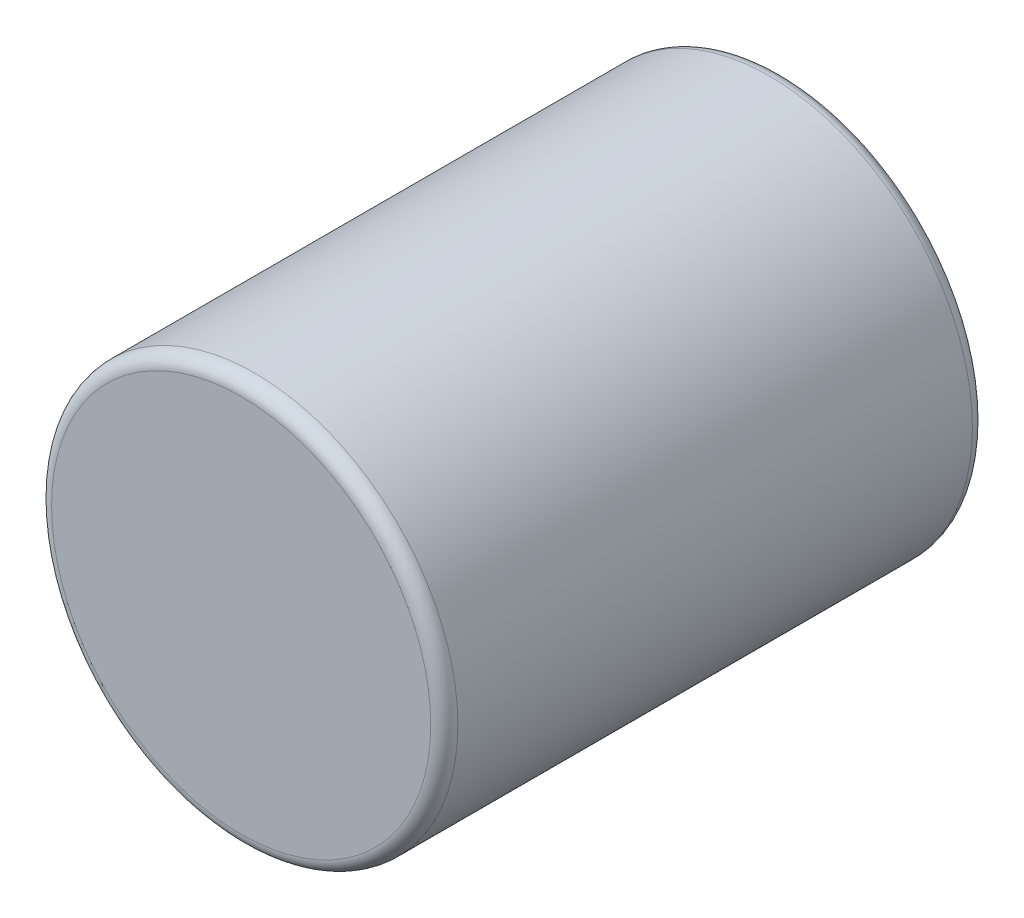
ISO-10303-21;
HEADER;
FILE_DESCRIPTION(('STEP AP214'),'2;1');
FILE_NAME('part.step','',(''),(''),'','','');
FILE_SCHEMA(('AUTOMOTIVE_DESIGN { 1 0 10303 214 1 1 1 1 }'));
ENDSEC;
DATA;
#1=APPLICATION_CONTEXT('core data for automotive mechanical design processes');
#2=APPLICATION_PROTOCOL_DEFINITION('international standard','automotive_design',2000,#1);
#3=PRODUCT_CONTEXT('',#1,'mechanical');
#4=PRODUCT('Part','Part','',(#3));
#5=PRODUCT_RELATED_PRODUCT_CATEGORY('part','',(#4));
#6=PRODUCT_DEFINITION_FORMATION('','',#4);
#7=PRODUCT_DEFINITION_CONTEXT('part definition',#1,'design');
#8=PRODUCT_DEFINITION('design','',#6,#7);
#9=PRODUCT_DEFINITION_SHAPE('','',#8);
#10=(LENGTH_UNIT() NAMED_UNIT(*) SI_UNIT(.MILLI.,.METRE.));
#11=(NAMED_UNIT(*) PLANE_ANGLE_UNIT() SI_UNIT($,.RADIAN.));
#12=(NAMED_UNIT(*) SI_UNIT($,.STERADIAN.) SOLID_ANGLE_UNIT());
#13=UNCERTAINTY_MEASURE_WITH_UNIT(LENGTH_MEASURE(1.E-05),#10,'distance_accuracy_value','');
#14=(GEOMETRIC_REPRESENTATION_CONTEXT(3) GLOBAL_UNCERTAINTY_ASSIGNED_CONTEXT((#13)) GLOBAL_UNIT_ASSIGNED_CONTEXT((#10,
#11,#12)) REPRESENTATION_CONTEXT('',''));
#15=CARTESIAN_POINT('',(0.,0.,0.));
#16=DIRECTION('',(0.,0.,1.));
#17=DIRECTION('',(1.,0.,0.));
#18=AXIS2_PLACEMENT_3D('',#15,#16,#17);
#19=CARTESIAN_POINT('',(0.,0.,4.));
#20=DIRECTION('',(0.,0.,-1.));
#21=DIRECTION('',(-1.,0.,0.));
#22=AXIS2_PLACEMENT_3D('',#19,#20,#21);
#23=CYLINDRICAL_SURFACE('',#22,1.5);
#24=CARTESIAN_POINT('',(0.,0.,3.9));
#25=DIRECTION('',(0.,0.,1.));
#26=DIRECTION('',(1.,0.,0.));
#27=AXIS2_PLACEMENT_3D('',#24,#25,#26);
#28=CIRCLE('',#27,1.5);
#29=CARTESIAN_POINT('',(1.5,0.,3.9));
#30=VERTEX_POINT('',#29);
#31=EDGE_CURVE('E45',#30,#30,#28,.F.);
#32=ORIENTED_EDGE('',*,*,#31,.T.);
#33=EDGE_LOOP('',(#32));
#34=FACE_BOUND('',#33,.T.);
#35=CARTESIAN_POINT('',(0.,0.,0.0999999999999998));
#36=DIRECTION('',(0.,0.,1.));
#37=DIRECTION('',(1.,0.,0.));
#38=AXIS2_PLACEMENT_3D('',#35,#36,#37);
#39=CIRCLE('',#38,1.5);
#40=CARTESIAN_POINT('',(1.5,0.,0.0999999999999998));
#41=VERTEX_POINT('',#40);
#42=EDGE_CURVE('E50',#41,#41,#39,.T.);
#43=ORIENTED_EDGE('',*,*,#42,.T.);
#44=EDGE_LOOP('',(#43));
#45=FACE_BOUND('',#44,.T.);
#46=ADVANCED_FACE('F37',(#34,#45),#23,.T.);
#47=CARTESIAN_POINT('',(0.,0.,4.));
#48=DIRECTION('',(0.,0.,1.));
#49=DIRECTION('',(1.,0.,0.));
#50=AXIS2_PLACEMENT_3D('',#47,#48,#49);
#51=PLANE('',#50);
#52=CARTESIAN_POINT('',(0.,0.,4.));
#53=DIRECTION('',(0.,0.,1.));
#54=DIRECTION('',(1.,0.,0.));
#55=AXIS2_PLACEMENT_3D('',#52,#53,#54);
#56=CIRCLE('',#55,1.4);
#57=CARTESIAN_POINT('',(1.4,0.,4.));
#58=VERTEX_POINT('',#57);
#59=EDGE_CURVE('E55',#58,#58,#56,.T.);
#60=ORIENTED_EDGE('',*,*,#59,.T.);
#61=EDGE_LOOP('',(#60));
#62=FACE_BOUND('',#61,.T.);
#63=ADVANCED_FACE('F62',(#62),#51,.T.);
#64=CARTESIAN_POINT('',(0.,0.,0.));
#65=DIRECTION('',(0.,0.,1.));
#66=DIRECTION('',(1.,0.,0.));
#67=AXIS2_PLACEMENT_3D('',#64,#65,#66);
#68=PLANE('',#67);
#69=CARTESIAN_POINT('',(0.,0.,0.));
#70=DIRECTION('',(0.,0.,1.));
#71=DIRECTION('',(1.,0.,0.));
#72=AXIS2_PLACEMENT_3D('',#69,#70,#71);
#73=CIRCLE('',#72,1.4);
#74=CARTESIAN_POINT('',(1.4,0.,0.));
#75=VERTEX_POINT('',#74);
#76=EDGE_CURVE('E10',#75,#75,#73,.F.);
#77=ORIENTED_EDGE('',*,*,#76,.T.);
#78=EDGE_LOOP('',(#77));
#79=FACE_BOUND('',#78,.T.);
#80=ADVANCED_FACE('F66',(#79),#68,.F.);
#81=CARTESIAN_POINT('',(0.,0.,3.9));
#82=DIRECTION('',(0.,0.,1.));
#83=DIRECTION('',(1.,0.,0.));
#84=AXIS2_PLACEMENT_3D('',#81,#82,#83);
#85=TOROIDAL_SURFACE('',#84,1.4,0.1);
#86=ORIENTED_EDGE('',*,*,#31,.F.);
#87=EDGE_LOOP('',(#86));
#88=FACE_BOUND('',#87,.T.);
#89=ORIENTED_EDGE('',*,*,#59,.F.);
#90=EDGE_LOOP('',(#89));
#91=FACE_BOUND('',#90,.T.);
#92=ADVANCED_FACE('F64',(#88,#91),#85,.T.);
#93=CARTESIAN_POINT('',(0.,0.,0.0999999999999998));
#94=DIRECTION('',(0.,0.,1.));
#95=DIRECTION('',(1.,0.,0.));
#96=AXIS2_PLACEMENT_3D('',#93,#94,#95);
#97=TOROIDAL_SURFACE('',#96,1.4,0.1);
#98=ORIENTED_EDGE('',*,*,#76,.F.);
#99=EDGE_LOOP('',(#98));
#100=FACE_BOUND('',#99,.T.);
#101=ORIENTED_EDGE('',*,*,#42,.F.);
#102=EDGE_LOOP('',(#101));
#103=FACE_BOUND('',#102,.T.);
#104=ADVANCED_FACE('F39',(#100,#103),#97,.T.);
#105=CLOSED_SHELL('',(#46,#63,#80,#92,#104));
#106=MANIFOLD_SOLID_BREP('B2',#105);
#107=ADVANCED_BREP_SHAPE_REPRESENTATION('',(#18,#106),#14);
#108=SHAPE_DEFINITION_REPRESENTATION(#9,#107);
ENDSEC;
END-ISO-10303-21;
